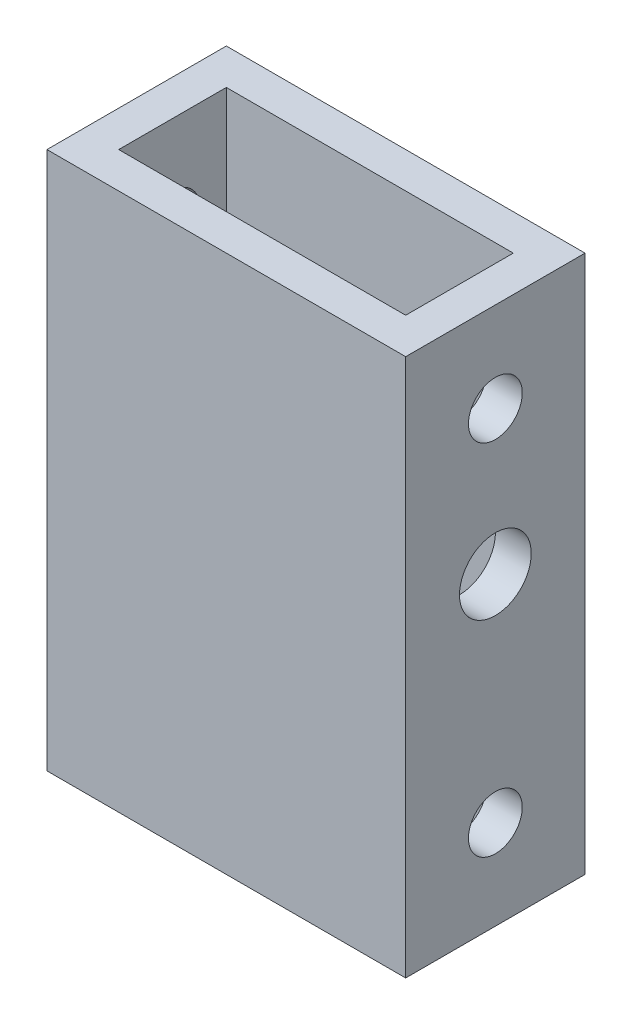
ISO-10303-21;
HEADER;
FILE_DESCRIPTION(('STEP AP214'),'2;1');
FILE_NAME('part.step','',(''),(''),'','','');
FILE_SCHEMA(('AUTOMOTIVE_DESIGN { 1 0 10303 214 1 1 1 1 }'));
ENDSEC;
DATA;
#1=APPLICATION_CONTEXT('core data for automotive mechanical design processes');
#2=APPLICATION_PROTOCOL_DEFINITION('international standard','automotive_design',2000,#1);
#3=PRODUCT_CONTEXT('',#1,'mechanical');
#4=PRODUCT('Part','Part','',(#3));
#5=PRODUCT_RELATED_PRODUCT_CATEGORY('part','',(#4));
#6=PRODUCT_DEFINITION_FORMATION('','',#4);
#7=PRODUCT_DEFINITION_CONTEXT('part definition',#1,'design');
#8=PRODUCT_DEFINITION('design','',#6,#7);
#9=PRODUCT_DEFINITION_SHAPE('','',#8);
#10=(LENGTH_UNIT() NAMED_UNIT(*) SI_UNIT(.MILLI.,.METRE.));
#11=(NAMED_UNIT(*) PLANE_ANGLE_UNIT() SI_UNIT($,.RADIAN.));
#12=(NAMED_UNIT(*) SI_UNIT($,.STERADIAN.) SOLID_ANGLE_UNIT());
#13=UNCERTAINTY_MEASURE_WITH_UNIT(LENGTH_MEASURE(1.E-05),#10,'distance_accuracy_value','');
#14=(GEOMETRIC_REPRESENTATION_CONTEXT(3) GLOBAL_UNCERTAINTY_ASSIGNED_CONTEXT((#13)) GLOBAL_UNIT_ASSIGNED_CONTEXT((#10,
#11,#12)) REPRESENTATION_CONTEXT('',''));
#15=CARTESIAN_POINT('',(0.,0.,0.));
#16=DIRECTION('',(0.,0.,1.));
#17=DIRECTION('',(1.,0.,0.));
#18=AXIS2_PLACEMENT_3D('',#15,#16,#17);
#19=CARTESIAN_POINT('',(0.,15.,0.));
#20=DIRECTION('',(0.,1.,0.));
#21=DIRECTION('',(0.,0.,1.));
#22=AXIS2_PLACEMENT_3D('',#19,#20,#21);
#23=PLANE('',#22);
#24=DIRECTION('',(0.,0.,-1.));
#25=VECTOR('',#24,1.);
#26=CARTESIAN_POINT('',(10.,15.,-5.));
#27=LINE('',#26,#25);
#28=CARTESIAN_POINT('',(10.,15.,5.));
#29=VERTEX_POINT('',#28);
#30=CARTESIAN_POINT('',(10.,15.,-5.));
#31=VERTEX_POINT('',#30);
#32=EDGE_CURVE('E140',#29,#31,#27,.T.);
#33=ORIENTED_EDGE('',*,*,#32,.T.);
#34=DIRECTION('',(-1.,0.,0.));
#35=VECTOR('',#34,1.);
#36=CARTESIAN_POINT('',(-10.,15.,-5.));
#37=LINE('',#36,#35);
#38=CARTESIAN_POINT('',(-10.,15.,-5.));
#39=VERTEX_POINT('',#38);
#40=EDGE_CURVE('E143',#31,#39,#37,.T.);
#41=ORIENTED_EDGE('',*,*,#40,.T.);
#42=DIRECTION('',(0.,0.,1.));
#43=VECTOR('',#42,1.);
#44=CARTESIAN_POINT('',(-10.,15.,-5.));
#45=LINE('',#44,#43);
#46=CARTESIAN_POINT('',(-10.,15.,5.));
#47=VERTEX_POINT('',#46);
#48=EDGE_CURVE('E146',#39,#47,#45,.T.);
#49=ORIENTED_EDGE('',*,*,#48,.T.);
#50=DIRECTION('',(1.,0.,0.));
#51=VECTOR('',#50,1.);
#52=CARTESIAN_POINT('',(-10.,15.,5.));
#53=LINE('',#52,#51);
#54=EDGE_CURVE('E148',#47,#29,#53,.T.);
#55=ORIENTED_EDGE('',*,*,#54,.T.);
#56=EDGE_LOOP('',(#33,#41,#49,#55));
#57=FACE_BOUND('',#56,.T.);
#58=DIRECTION('',(-1.,0.,0.));
#59=VECTOR('',#58,1.);
#60=CARTESIAN_POINT('',(-8.,15.,-3.));
#61=LINE('',#60,#59);
#62=CARTESIAN_POINT('',(8.,15.,-3.));
#63=VERTEX_POINT('',#62);
#64=CARTESIAN_POINT('',(-8.,15.,-3.));
#65=VERTEX_POINT('',#64);
#66=EDGE_CURVE('E110',#63,#65,#61,.T.);
#67=ORIENTED_EDGE('',*,*,#66,.F.);
#68=DIRECTION('',(0.,0.,-1.));
#69=VECTOR('',#68,1.);
#70=CARTESIAN_POINT('',(8.,15.,-3.));
#71=LINE('',#70,#69);
#72=CARTESIAN_POINT('',(8.,15.,3.));
#73=VERTEX_POINT('',#72);
#74=EDGE_CURVE('E102',#73,#63,#71,.T.);
#75=ORIENTED_EDGE('',*,*,#74,.F.);
#76=DIRECTION('',(1.,0.,0.));
#77=VECTOR('',#76,1.);
#78=CARTESIAN_POINT('',(-8.,15.,3.));
#79=LINE('',#78,#77);
#80=CARTESIAN_POINT('',(-8.,15.,3.));
#81=VERTEX_POINT('',#80);
#82=EDGE_CURVE('E124',#81,#73,#79,.T.);
#83=ORIENTED_EDGE('',*,*,#82,.F.);
#84=DIRECTION('',(0.,0.,1.));
#85=VECTOR('',#84,1.);
#86=CARTESIAN_POINT('',(-8.,15.,-3.));
#87=LINE('',#86,#85);
#88=EDGE_CURVE('E122',#65,#81,#87,.T.);
#89=ORIENTED_EDGE('',*,*,#88,.F.);
#90=EDGE_LOOP('',(#67,#75,#83,#89));
#91=FACE_BOUND('',#90,.T.);
#92=ADVANCED_FACE('F35',(#57,#91),#23,.T.);
#93=CARTESIAN_POINT('',(0.,-15.,0.));
#94=DIRECTION('',(0.,1.,0.));
#95=DIRECTION('',(0.,0.,1.));
#96=AXIS2_PLACEMENT_3D('',#93,#94,#95);
#97=PLANE('',#96);
#98=DIRECTION('',(0.,0.,-1.));
#99=VECTOR('',#98,1.);
#100=CARTESIAN_POINT('',(10.,-15.,-5.));
#101=LINE('',#100,#99);
#102=CARTESIAN_POINT('',(10.,-15.,5.));
#103=VERTEX_POINT('',#102);
#104=CARTESIAN_POINT('',(10.,-15.,-5.));
#105=VERTEX_POINT('',#104);
#106=EDGE_CURVE('E118',#103,#105,#101,.T.);
#107=ORIENTED_EDGE('',*,*,#106,.F.);
#108=DIRECTION('',(1.,0.,0.));
#109=VECTOR('',#108,1.);
#110=CARTESIAN_POINT('',(-10.,-15.,5.));
#111=LINE('',#110,#109);
#112=CARTESIAN_POINT('',(-10.,-15.,5.));
#113=VERTEX_POINT('',#112);
#114=EDGE_CURVE('E144',#113,#103,#111,.T.);
#115=ORIENTED_EDGE('',*,*,#114,.F.);
#116=DIRECTION('',(0.,0.,1.));
#117=VECTOR('',#116,1.);
#118=CARTESIAN_POINT('',(-10.,-15.,-5.));
#119=LINE('',#118,#117);
#120=CARTESIAN_POINT('',(-10.,-15.,-5.));
#121=VERTEX_POINT('',#120);
#122=EDGE_CURVE('E155',#121,#113,#119,.T.);
#123=ORIENTED_EDGE('',*,*,#122,.F.);
#124=DIRECTION('',(-1.,0.,0.));
#125=VECTOR('',#124,1.);
#126=CARTESIAN_POINT('',(-10.,-15.,-5.));
#127=LINE('',#126,#125);
#128=EDGE_CURVE('E153',#105,#121,#127,.T.);
#129=ORIENTED_EDGE('',*,*,#128,.F.);
#130=EDGE_LOOP('',(#107,#115,#123,#129));
#131=FACE_BOUND('',#130,.T.);
#132=DIRECTION('',(0.,0.,-1.));
#133=VECTOR('',#132,1.);
#134=CARTESIAN_POINT('',(8.,-15.,-3.));
#135=LINE('',#134,#133);
#136=CARTESIAN_POINT('',(8.,-15.,3.));
#137=VERTEX_POINT('',#136);
#138=CARTESIAN_POINT('',(8.,-15.,-3.));
#139=VERTEX_POINT('',#138);
#140=EDGE_CURVE('E60',#137,#139,#135,.T.);
#141=ORIENTED_EDGE('',*,*,#140,.T.);
#142=DIRECTION('',(-1.,0.,0.));
#143=VECTOR('',#142,1.);
#144=CARTESIAN_POINT('',(-8.,-15.,-3.));
#145=LINE('',#144,#143);
#146=CARTESIAN_POINT('',(-8.,-15.,-3.));
#147=VERTEX_POINT('',#146);
#148=EDGE_CURVE('E117',#139,#147,#145,.T.);
#149=ORIENTED_EDGE('',*,*,#148,.T.);
#150=DIRECTION('',(0.,0.,1.));
#151=VECTOR('',#150,1.);
#152=CARTESIAN_POINT('',(-8.,-15.,-3.));
#153=LINE('',#152,#151);
#154=CARTESIAN_POINT('',(-8.,-15.,3.));
#155=VERTEX_POINT('',#154);
#156=EDGE_CURVE('E132',#147,#155,#153,.T.);
#157=ORIENTED_EDGE('',*,*,#156,.T.);
#158=DIRECTION('',(1.,0.,0.));
#159=VECTOR('',#158,1.);
#160=CARTESIAN_POINT('',(-8.,-15.,3.));
#161=LINE('',#160,#159);
#162=EDGE_CURVE('E111',#155,#137,#161,.T.);
#163=ORIENTED_EDGE('',*,*,#162,.T.);
#164=EDGE_LOOP('',(#141,#149,#157,#163));
#165=FACE_BOUND('',#164,.T.);
#166=ADVANCED_FACE('F202',(#131,#165),#97,.F.);
#167=CARTESIAN_POINT('',(10.,15.,-5.));
#168=DIRECTION('',(-1.,0.,0.));
#169=DIRECTION('',(0.,0.,1.));
#170=AXIS2_PLACEMENT_3D('',#167,#168,#169);
#171=PLANE('',#170);
#172=CARTESIAN_POINT('',(10.,-10.,0.));
#173=DIRECTION('',(-1.,0.,0.));
#174=DIRECTION('',(0.,0.,1.));
#175=AXIS2_PLACEMENT_3D('',#172,#173,#174);
#176=CIRCLE('',#175,1.5);
#177=CARTESIAN_POINT('',(10.,-10.,1.5));
#178=VERTEX_POINT('',#177);
#179=EDGE_CURVE('E255',#178,#178,#176,.T.);
#180=ORIENTED_EDGE('',*,*,#179,.T.);
#181=EDGE_LOOP('',(#180));
#182=FACE_BOUND('',#181,.T.);
#183=CARTESIAN_POINT('',(10.,10.,0.));
#184=DIRECTION('',(-1.,0.,0.));
#185=DIRECTION('',(0.,0.,1.));
#186=AXIS2_PLACEMENT_3D('',#183,#184,#185);
#187=CIRCLE('',#186,1.5);
#188=CARTESIAN_POINT('',(10.,10.,1.5));
#189=VERTEX_POINT('',#188);
#190=EDGE_CURVE('E259',#189,#189,#187,.T.);
#191=ORIENTED_EDGE('',*,*,#190,.T.);
#192=EDGE_LOOP('',(#191));
#193=FACE_BOUND('',#192,.T.);
#194=CARTESIAN_POINT('',(10.,2.00000000000283,2.61943244872498E-13));
#195=DIRECTION('',(-1.,0.,0.));
#196=DIRECTION('',(0.,0.,1.));
#197=AXIS2_PLACEMENT_3D('',#194,#195,#196);
#198=CIRCLE('',#197,1.99999999999849);
#199=CARTESIAN_POINT('',(10.,2.00000000000283,1.99999999999875));
#200=VERTEX_POINT('',#199);
#201=EDGE_CURVE('E168',#200,#200,#198,.T.);
#202=ORIENTED_EDGE('',*,*,#201,.T.);
#203=EDGE_LOOP('',(#202));
#204=FACE_BOUND('',#203,.T.);
#205=ORIENTED_EDGE('',*,*,#106,.T.);
#206=DIRECTION('',(0.,-1.,0.));
#207=VECTOR('',#206,1.);
#208=CARTESIAN_POINT('',(10.,15.,-5.));
#209=LINE('',#208,#207);
#210=EDGE_CURVE('E11',#31,#105,#209,.T.);
#211=ORIENTED_EDGE('',*,*,#210,.F.);
#212=ORIENTED_EDGE('',*,*,#32,.F.);
#213=DIRECTION('',(0.,-1.,0.));
#214=VECTOR('',#213,1.);
#215=CARTESIAN_POINT('',(10.,15.,5.));
#216=LINE('',#215,#214);
#217=EDGE_CURVE('E150',#29,#103,#216,.T.);
#218=ORIENTED_EDGE('',*,*,#217,.T.);
#219=EDGE_LOOP('',(#205,#211,#212,#218));
#220=FACE_BOUND('',#219,.T.);
#221=ADVANCED_FACE('F37',(#182,#193,#204,#220),#171,.F.);
#222=CARTESIAN_POINT('',(-10.,15.,-5.));
#223=DIRECTION('',(0.,0.,1.));
#224=DIRECTION('',(1.,0.,0.));
#225=AXIS2_PLACEMENT_3D('',#222,#223,#224);
#226=PLANE('',#225);
#227=ORIENTED_EDGE('',*,*,#128,.T.);
#228=DIRECTION('',(0.,-1.,0.));
#229=VECTOR('',#228,1.);
#230=CARTESIAN_POINT('',(-10.,15.,-5.));
#231=LINE('',#230,#229);
#232=EDGE_CURVE('E44',#39,#121,#231,.T.);
#233=ORIENTED_EDGE('',*,*,#232,.F.);
#234=ORIENTED_EDGE('',*,*,#40,.F.);
#235=ORIENTED_EDGE('',*,*,#210,.T.);
#236=EDGE_LOOP('',(#227,#233,#234,#235));
#237=FACE_BOUND('',#236,.T.);
#238=ADVANCED_FACE('F230',(#237),#226,.F.);
#239=CARTESIAN_POINT('',(-10.,15.,-5.));
#240=DIRECTION('',(1.,0.,0.));
#241=DIRECTION('',(0.,0.,-1.));
#242=AXIS2_PLACEMENT_3D('',#239,#240,#241);
#243=PLANE('',#242);
#244=CARTESIAN_POINT('',(-10.,-10.,0.));
#245=DIRECTION('',(-1.,0.,0.));
#246=DIRECTION('',(0.,0.,1.));
#247=AXIS2_PLACEMENT_3D('',#244,#245,#246);
#248=CIRCLE('',#247,1.5);
#249=CARTESIAN_POINT('',(-10.,-10.,1.5));
#250=VERTEX_POINT('',#249);
#251=EDGE_CURVE('E265',#250,#250,#248,.T.);
#252=ORIENTED_EDGE('',*,*,#251,.F.);
#253=EDGE_LOOP('',(#252));
#254=FACE_BOUND('',#253,.T.);
#255=CARTESIAN_POINT('',(-10.,10.,0.));
#256=DIRECTION('',(-1.,0.,0.));
#257=DIRECTION('',(0.,0.,1.));
#258=AXIS2_PLACEMENT_3D('',#255,#256,#257);
#259=CIRCLE('',#258,1.5);
#260=CARTESIAN_POINT('',(-10.,10.,1.5));
#261=VERTEX_POINT('',#260);
#262=EDGE_CURVE('E269',#261,#261,#259,.T.);
#263=ORIENTED_EDGE('',*,*,#262,.F.);
#264=EDGE_LOOP('',(#263));
#265=FACE_BOUND('',#264,.T.);
#266=CARTESIAN_POINT('',(-10.,2.00000000000283,2.65412691824451E-13));
#267=DIRECTION('',(-1.,0.,0.));
#268=DIRECTION('',(0.,0.,1.));
#269=AXIS2_PLACEMENT_3D('',#266,#267,#268);
#270=CIRCLE('',#269,1.99999999999849);
#271=CARTESIAN_POINT('',(-10.,2.00000000000283,1.99999999999875));
#272=VERTEX_POINT('',#271);
#273=EDGE_CURVE('E181',#272,#272,#270,.T.);
#274=ORIENTED_EDGE('',*,*,#273,.F.);
#275=EDGE_LOOP('',(#274));
#276=FACE_BOUND('',#275,.T.);
#277=ORIENTED_EDGE('',*,*,#122,.T.);
#278=DIRECTION('',(0.,-1.,0.));
#279=VECTOR('',#278,1.);
#280=CARTESIAN_POINT('',(-10.,15.,5.));
#281=LINE('',#280,#279);
#282=EDGE_CURVE('E160',#47,#113,#281,.T.);
#283=ORIENTED_EDGE('',*,*,#282,.F.);
#284=ORIENTED_EDGE('',*,*,#48,.F.);
#285=ORIENTED_EDGE('',*,*,#232,.T.);
#286=EDGE_LOOP('',(#277,#283,#284,#285));
#287=FACE_BOUND('',#286,.T.);
#288=ADVANCED_FACE('F227',(#254,#265,#276,#287),#243,.F.);
#289=CARTESIAN_POINT('',(-10.,15.,5.));
#290=DIRECTION('',(0.,0.,-1.));
#291=DIRECTION('',(-1.,0.,0.));
#292=AXIS2_PLACEMENT_3D('',#289,#290,#291);
#293=PLANE('',#292);
#294=ORIENTED_EDGE('',*,*,#114,.T.);
#295=ORIENTED_EDGE('',*,*,#217,.F.);
#296=ORIENTED_EDGE('',*,*,#54,.F.);
#297=ORIENTED_EDGE('',*,*,#282,.T.);
#298=EDGE_LOOP('',(#294,#295,#296,#297));
#299=FACE_BOUND('',#298,.T.);
#300=ADVANCED_FACE('F224',(#299),#293,.F.);
#301=CARTESIAN_POINT('',(8.,15.,-3.));
#302=DIRECTION('',(-1.,0.,0.));
#303=DIRECTION('',(0.,0.,1.));
#304=AXIS2_PLACEMENT_3D('',#301,#302,#303);
#305=PLANE('',#304);
#306=CARTESIAN_POINT('',(8.,-10.,0.));
#307=DIRECTION('',(-1.,0.,0.));
#308=DIRECTION('',(0.,0.,1.));
#309=AXIS2_PLACEMENT_3D('',#306,#307,#308);
#310=CIRCLE('',#309,1.5);
#311=CARTESIAN_POINT('',(8.,-10.,1.5));
#312=VERTEX_POINT('',#311);
#313=EDGE_CURVE('E130',#312,#312,#310,.T.);
#314=ORIENTED_EDGE('',*,*,#313,.F.);
#315=EDGE_LOOP('',(#314));
#316=FACE_BOUND('',#315,.T.);
#317=CARTESIAN_POINT('',(8.,10.,0.));
#318=DIRECTION('',(-1.,0.,0.));
#319=DIRECTION('',(0.,0.,1.));
#320=AXIS2_PLACEMENT_3D('',#317,#318,#319);
#321=CIRCLE('',#320,1.5);
#322=CARTESIAN_POINT('',(8.,10.,1.5));
#323=VERTEX_POINT('',#322);
#324=EDGE_CURVE('E171',#323,#323,#321,.T.);
#325=ORIENTED_EDGE('',*,*,#324,.F.);
#326=EDGE_LOOP('',(#325));
#327=FACE_BOUND('',#326,.T.);
#328=CARTESIAN_POINT('',(8.,2.00000000000283,2.62290189567693E-13));
#329=DIRECTION('',(-1.,0.,0.));
#330=DIRECTION('',(0.,0.,1.));
#331=AXIS2_PLACEMENT_3D('',#328,#329,#330);
#332=CIRCLE('',#331,1.99999999999849);
#333=CARTESIAN_POINT('',(8.,2.00000000000283,1.99999999999875));
#334=VERTEX_POINT('',#333);
#335=EDGE_CURVE('E167',#334,#334,#332,.T.);
#336=ORIENTED_EDGE('',*,*,#335,.F.);
#337=EDGE_LOOP('',(#336));
#338=FACE_BOUND('',#337,.T.);
#339=ORIENTED_EDGE('',*,*,#140,.F.);
#340=DIRECTION('',(0.,-1.,0.));
#341=VECTOR('',#340,1.);
#342=CARTESIAN_POINT('',(8.,15.,3.));
#343=LINE('',#342,#341);
#344=EDGE_CURVE('E106',#73,#137,#343,.T.);
#345=ORIENTED_EDGE('',*,*,#344,.F.);
#346=ORIENTED_EDGE('',*,*,#74,.T.);
#347=DIRECTION('',(0.,-1.,0.));
#348=VECTOR('',#347,1.);
#349=CARTESIAN_POINT('',(8.,15.,-3.));
#350=LINE('',#349,#348);
#351=EDGE_CURVE('E105',#63,#139,#350,.T.);
#352=ORIENTED_EDGE('',*,*,#351,.T.);
#353=EDGE_LOOP('',(#339,#345,#346,#352));
#354=FACE_BOUND('',#353,.T.);
#355=ADVANCED_FACE('F104',(#316,#327,#338,#354),#305,.T.);
#356=CARTESIAN_POINT('',(-8.,15.,-3.));
#357=DIRECTION('',(0.,0.,1.));
#358=DIRECTION('',(1.,0.,0.));
#359=AXIS2_PLACEMENT_3D('',#356,#357,#358);
#360=PLANE('',#359);
#361=ORIENTED_EDGE('',*,*,#148,.F.);
#362=ORIENTED_EDGE('',*,*,#351,.F.);
#363=ORIENTED_EDGE('',*,*,#66,.T.);
#364=DIRECTION('',(0.,-1.,0.));
#365=VECTOR('',#364,1.);
#366=CARTESIAN_POINT('',(-8.,15.,-3.));
#367=LINE('',#366,#365);
#368=EDGE_CURVE('E119',#65,#147,#367,.T.);
#369=ORIENTED_EDGE('',*,*,#368,.T.);
#370=EDGE_LOOP('',(#361,#362,#363,#369));
#371=FACE_BOUND('',#370,.T.);
#372=ADVANCED_FACE('F114',(#371),#360,.T.);
#373=CARTESIAN_POINT('',(-8.,15.,-3.));
#374=DIRECTION('',(1.,0.,0.));
#375=DIRECTION('',(0.,0.,-1.));
#376=AXIS2_PLACEMENT_3D('',#373,#374,#375);
#377=PLANE('',#376);
#378=CARTESIAN_POINT('',(-8.,-10.,0.));
#379=DIRECTION('',(1.,0.,0.));
#380=DIRECTION('',(0.,0.,-1.));
#381=AXIS2_PLACEMENT_3D('',#378,#379,#380);
#382=CIRCLE('',#381,1.5);
#383=CARTESIAN_POINT('',(-8.,-10.,-1.5));
#384=VERTEX_POINT('',#383);
#385=EDGE_CURVE('E39',#384,#384,#382,.T.);
#386=ORIENTED_EDGE('',*,*,#385,.F.);
#387=EDGE_LOOP('',(#386));
#388=FACE_BOUND('',#387,.T.);
#389=CARTESIAN_POINT('',(-8.,10.,0.));
#390=DIRECTION('',(1.,0.,0.));
#391=DIRECTION('',(0.,0.,-1.));
#392=AXIS2_PLACEMENT_3D('',#389,#390,#391);
#393=CIRCLE('',#392,1.5);
#394=CARTESIAN_POINT('',(-8.,10.,-1.5));
#395=VERTEX_POINT('',#394);
#396=EDGE_CURVE('E169',#395,#395,#393,.T.);
#397=ORIENTED_EDGE('',*,*,#396,.F.);
#398=EDGE_LOOP('',(#397));
#399=FACE_BOUND('',#398,.T.);
#400=CARTESIAN_POINT('',(-8.,2.00000000000283,2.65065747129256E-13));
#401=DIRECTION('',(1.,0.,0.));
#402=DIRECTION('',(0.,0.,-1.));
#403=AXIS2_PLACEMENT_3D('',#400,#401,#402);
#404=CIRCLE('',#403,1.99999999999849);
#405=CARTESIAN_POINT('',(-8.,2.00000000000283,-1.99999999999822));
#406=VERTEX_POINT('',#405);
#407=EDGE_CURVE('E165',#406,#406,#404,.T.);
#408=ORIENTED_EDGE('',*,*,#407,.F.);
#409=EDGE_LOOP('',(#408));
#410=FACE_BOUND('',#409,.T.);
#411=ORIENTED_EDGE('',*,*,#156,.F.);
#412=ORIENTED_EDGE('',*,*,#368,.F.);
#413=ORIENTED_EDGE('',*,*,#88,.T.);
#414=DIRECTION('',(0.,-1.,0.));
#415=VECTOR('',#414,1.);
#416=CARTESIAN_POINT('',(-8.,15.,3.));
#417=LINE('',#416,#415);
#418=EDGE_CURVE('E52',#81,#155,#417,.T.);
#419=ORIENTED_EDGE('',*,*,#418,.T.);
#420=EDGE_LOOP('',(#411,#412,#413,#419));
#421=FACE_BOUND('',#420,.T.);
#422=ADVANCED_FACE('F192',(#388,#399,#410,#421),#377,.T.);
#423=CARTESIAN_POINT('',(-8.,15.,3.));
#424=DIRECTION('',(0.,0.,-1.));
#425=DIRECTION('',(-1.,0.,0.));
#426=AXIS2_PLACEMENT_3D('',#423,#424,#425);
#427=PLANE('',#426);
#428=ORIENTED_EDGE('',*,*,#162,.F.);
#429=ORIENTED_EDGE('',*,*,#418,.F.);
#430=ORIENTED_EDGE('',*,*,#82,.T.);
#431=ORIENTED_EDGE('',*,*,#344,.T.);
#432=EDGE_LOOP('',(#428,#429,#430,#431));
#433=FACE_BOUND('',#432,.T.);
#434=ADVANCED_FACE('F195',(#433),#427,.T.);
#435=CARTESIAN_POINT('',(10.,2.00000000000283,2.61943244872498E-13));
#436=DIRECTION('',(-1.,0.,0.));
#437=DIRECTION('',(0.,0.,1.));
#438=AXIS2_PLACEMENT_3D('',#435,#436,#437);
#439=CYLINDRICAL_SURFACE('',#438,1.99999999999849);
#440=ORIENTED_EDGE('',*,*,#407,.T.);
#441=EDGE_LOOP('',(#440));
#442=FACE_BOUND('',#441,.T.);
#443=ORIENTED_EDGE('',*,*,#273,.T.);
#444=EDGE_LOOP('',(#443));
#445=FACE_BOUND('',#444,.T.);
#446=ADVANCED_FACE('F204',(#442,#445),#439,.F.);
#447=CARTESIAN_POINT('',(10.,10.,0.));
#448=DIRECTION('',(-1.,0.,0.));
#449=DIRECTION('',(0.,0.,1.));
#450=AXIS2_PLACEMENT_3D('',#447,#448,#449);
#451=CYLINDRICAL_SURFACE('',#450,1.5);
#452=ORIENTED_EDGE('',*,*,#396,.T.);
#453=EDGE_LOOP('',(#452));
#454=FACE_BOUND('',#453,.T.);
#455=ORIENTED_EDGE('',*,*,#262,.T.);
#456=EDGE_LOOP('',(#455));
#457=FACE_BOUND('',#456,.T.);
#458=ADVANCED_FACE('F209',(#454,#457),#451,.F.);
#459=CARTESIAN_POINT('',(10.,-10.,0.));
#460=DIRECTION('',(-1.,0.,0.));
#461=DIRECTION('',(0.,0.,1.));
#462=AXIS2_PLACEMENT_3D('',#459,#460,#461);
#463=CYLINDRICAL_SURFACE('',#462,1.5);
#464=ORIENTED_EDGE('',*,*,#385,.T.);
#465=EDGE_LOOP('',(#464));
#466=FACE_BOUND('',#465,.T.);
#467=ORIENTED_EDGE('',*,*,#251,.T.);
#468=EDGE_LOOP('',(#467));
#469=FACE_BOUND('',#468,.T.);
#470=ADVANCED_FACE('F189',(#466,#469),#463,.F.);
#471=ORIENTED_EDGE('',*,*,#335,.T.);
#472=EDGE_LOOP('',(#471));
#473=FACE_BOUND('',#472,.T.);
#474=ORIENTED_EDGE('',*,*,#201,.F.);
#475=EDGE_LOOP('',(#474));
#476=FACE_BOUND('',#475,.T.);
#477=ADVANCED_FACE('F212',(#473,#476),#439,.F.);
#478=ORIENTED_EDGE('',*,*,#324,.T.);
#479=EDGE_LOOP('',(#478));
#480=FACE_BOUND('',#479,.T.);
#481=ORIENTED_EDGE('',*,*,#190,.F.);
#482=EDGE_LOOP('',(#481));
#483=FACE_BOUND('',#482,.T.);
#484=ADVANCED_FACE('F280',(#480,#483),#451,.F.);
#485=ORIENTED_EDGE('',*,*,#313,.T.);
#486=EDGE_LOOP('',(#485));
#487=FACE_BOUND('',#486,.T.);
#488=ORIENTED_EDGE('',*,*,#179,.F.);
#489=EDGE_LOOP('',(#488));
#490=FACE_BOUND('',#489,.T.);
#491=ADVANCED_FACE('F285',(#487,#490),#463,.F.);
#492=CLOSED_SHELL('',(#92,#166,#221,#238,#288,#300,#355,#372,#422,#434,#446,#458,#470,#477,#484,#491));
#493=MANIFOLD_SOLID_BREP('B2',#492);
#494=ADVANCED_BREP_SHAPE_REPRESENTATION('',(#18,#493),#14);
#495=SHAPE_DEFINITION_REPRESENTATION(#9,#494);
ENDSEC;
END-ISO-10303-21;
